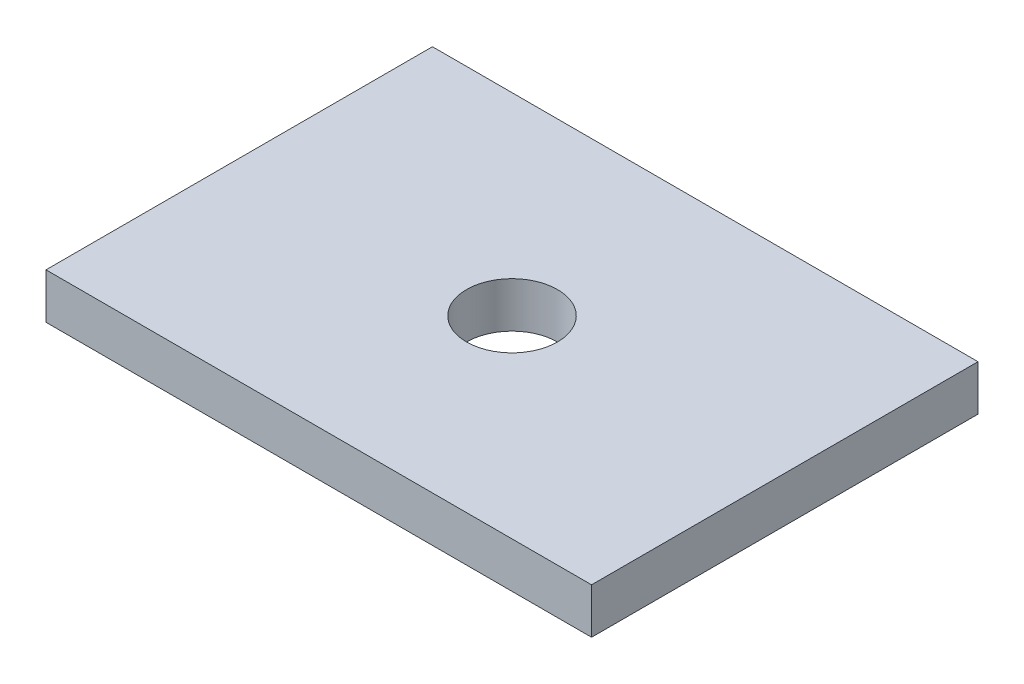
ISO-10303-21;
HEADER;
FILE_DESCRIPTION(('STEP AP214'),'2;1');
FILE_NAME('part.step','',(''),(''),'','','');
FILE_SCHEMA(('AUTOMOTIVE_DESIGN { 1 0 10303 214 1 1 1 1 }'));
ENDSEC;
DATA;
#1=APPLICATION_CONTEXT('core data for automotive mechanical design processes');
#2=APPLICATION_PROTOCOL_DEFINITION('international standard','automotive_design',2000,#1);
#3=PRODUCT_CONTEXT('',#1,'mechanical');
#4=PRODUCT('Part','Part','',(#3));
#5=PRODUCT_RELATED_PRODUCT_CATEGORY('part','',(#4));
#6=PRODUCT_DEFINITION_FORMATION('','',#4);
#7=PRODUCT_DEFINITION_CONTEXT('part definition',#1,'design');
#8=PRODUCT_DEFINITION('design','',#6,#7);
#9=PRODUCT_DEFINITION_SHAPE('','',#8);
#10=(LENGTH_UNIT() NAMED_UNIT(*) SI_UNIT(.MILLI.,.METRE.));
#11=(NAMED_UNIT(*) PLANE_ANGLE_UNIT() SI_UNIT($,.RADIAN.));
#12=(NAMED_UNIT(*) SI_UNIT($,.STERADIAN.) SOLID_ANGLE_UNIT());
#13=UNCERTAINTY_MEASURE_WITH_UNIT(LENGTH_MEASURE(1.E-05),#10,'distance_accuracy_value','');
#14=(GEOMETRIC_REPRESENTATION_CONTEXT(3) GLOBAL_UNCERTAINTY_ASSIGNED_CONTEXT((#13)) GLOBAL_UNIT_ASSIGNED_CONTEXT((#10,
#11,#12)) REPRESENTATION_CONTEXT('',''));
#15=CARTESIAN_POINT('',(0.,0.,0.));
#16=DIRECTION('',(0.,0.,1.));
#17=DIRECTION('',(1.,0.,0.));
#18=AXIS2_PLACEMENT_3D('',#15,#16,#17);
#19=CARTESIAN_POINT('',(0.,4.,0.));
#20=DIRECTION('',(0.,1.,0.));
#21=DIRECTION('',(0.,0.,1.));
#22=AXIS2_PLACEMENT_3D('',#19,#20,#21);
#23=PLANE('',#22);
#24=DIRECTION('',(0.,0.,-1.));
#25=VECTOR('',#24,1.);
#26=CARTESIAN_POINT('',(24.,4.,-17.));
#27=LINE('',#26,#25);
#28=CARTESIAN_POINT('',(24.,4.,17.));
#29=VERTEX_POINT('',#28);
#30=CARTESIAN_POINT('',(24.,4.,-17.));
#31=VERTEX_POINT('',#30);
#32=EDGE_CURVE('E85',#29,#31,#27,.T.);
#33=ORIENTED_EDGE('',*,*,#32,.T.);
#34=DIRECTION('',(-1.,0.,0.));
#35=VECTOR('',#34,1.);
#36=CARTESIAN_POINT('',(-24.,4.,-17.));
#37=LINE('',#36,#35);
#38=CARTESIAN_POINT('',(-24.,4.,-17.));
#39=VERTEX_POINT('',#38);
#40=EDGE_CURVE('E80',#31,#39,#37,.T.);
#41=ORIENTED_EDGE('',*,*,#40,.T.);
#42=DIRECTION('',(0.,0.,1.));
#43=VECTOR('',#42,1.);
#44=CARTESIAN_POINT('',(-24.,4.,-17.));
#45=LINE('',#44,#43);
#46=CARTESIAN_POINT('',(-24.,4.,17.));
#47=VERTEX_POINT('',#46);
#48=EDGE_CURVE('E83',#39,#47,#45,.T.);
#49=ORIENTED_EDGE('',*,*,#48,.T.);
#50=DIRECTION('',(1.,0.,0.));
#51=VECTOR('',#50,1.);
#52=CARTESIAN_POINT('',(-24.,4.,17.));
#53=LINE('',#52,#51);
#54=EDGE_CURVE('E50',#47,#29,#53,.T.);
#55=ORIENTED_EDGE('',*,*,#54,.T.);
#56=EDGE_LOOP('',(#33,#41,#49,#55));
#57=FACE_BOUND('',#56,.T.);
#58=CARTESIAN_POINT('',(0.,4.,0.));
#59=DIRECTION('',(0.,1.,0.));
#60=DIRECTION('',(0.,0.,1.));
#61=AXIS2_PLACEMENT_3D('',#58,#59,#60);
#62=CIRCLE('',#61,4.);
#63=CARTESIAN_POINT('',(0.,4.,4.));
#64=VERTEX_POINT('',#63);
#65=EDGE_CURVE('E100',#64,#64,#62,.T.);
#66=ORIENTED_EDGE('',*,*,#65,.F.);
#67=EDGE_LOOP('',(#66));
#68=FACE_BOUND('',#67,.T.);
#69=ADVANCED_FACE('F33',(#57,#68),#23,.T.);
#70=CARTESIAN_POINT('',(0.,0.,0.));
#71=DIRECTION('',(0.,1.,0.));
#72=DIRECTION('',(0.,0.,1.));
#73=AXIS2_PLACEMENT_3D('',#70,#71,#72);
#74=PLANE('',#73);
#75=DIRECTION('',(0.,0.,-1.));
#76=VECTOR('',#75,1.);
#77=CARTESIAN_POINT('',(24.,0.,-17.));
#78=LINE('',#77,#76);
#79=CARTESIAN_POINT('',(24.,0.,17.));
#80=VERTEX_POINT('',#79);
#81=CARTESIAN_POINT('',(24.,0.,-17.));
#82=VERTEX_POINT('',#81);
#83=EDGE_CURVE('E97',#80,#82,#78,.T.);
#84=ORIENTED_EDGE('',*,*,#83,.F.);
#85=DIRECTION('',(1.,0.,0.));
#86=VECTOR('',#85,1.);
#87=CARTESIAN_POINT('',(-24.,0.,17.));
#88=LINE('',#87,#86);
#89=CARTESIAN_POINT('',(-24.,0.,17.));
#90=VERTEX_POINT('',#89);
#91=EDGE_CURVE('E73',#90,#80,#88,.T.);
#92=ORIENTED_EDGE('',*,*,#91,.F.);
#93=DIRECTION('',(0.,0.,1.));
#94=VECTOR('',#93,1.);
#95=CARTESIAN_POINT('',(-24.,0.,-17.));
#96=LINE('',#95,#94);
#97=CARTESIAN_POINT('',(-24.,0.,-17.));
#98=VERTEX_POINT('',#97);
#99=EDGE_CURVE('E67',#98,#90,#96,.T.);
#100=ORIENTED_EDGE('',*,*,#99,.F.);
#101=DIRECTION('',(-1.,0.,0.));
#102=VECTOR('',#101,1.);
#103=CARTESIAN_POINT('',(-24.,0.,-17.));
#104=LINE('',#103,#102);
#105=EDGE_CURVE('E89',#82,#98,#104,.T.);
#106=ORIENTED_EDGE('',*,*,#105,.F.);
#107=EDGE_LOOP('',(#84,#92,#100,#106));
#108=FACE_BOUND('',#107,.T.);
#109=CARTESIAN_POINT('',(0.,0.,0.));
#110=DIRECTION('',(0.,1.,0.));
#111=DIRECTION('',(0.,0.,1.));
#112=AXIS2_PLACEMENT_3D('',#109,#110,#111);
#113=CIRCLE('',#112,4.);
#114=CARTESIAN_POINT('',(0.,0.,4.));
#115=VERTEX_POINT('',#114);
#116=EDGE_CURVE('E112',#115,#115,#113,.T.);
#117=ORIENTED_EDGE('',*,*,#116,.T.);
#118=EDGE_LOOP('',(#117));
#119=FACE_BOUND('',#118,.T.);
#120=ADVANCED_FACE('F108',(#108,#119),#74,.F.);
#121=CARTESIAN_POINT('',(24.,4.,-17.));
#122=DIRECTION('',(-1.,0.,0.));
#123=DIRECTION('',(0.,0.,1.));
#124=AXIS2_PLACEMENT_3D('',#121,#122,#123);
#125=PLANE('',#124);
#126=ORIENTED_EDGE('',*,*,#83,.T.);
#127=DIRECTION('',(0.,-1.,0.));
#128=VECTOR('',#127,1.);
#129=CARTESIAN_POINT('',(24.,4.,-17.));
#130=LINE('',#129,#128);
#131=EDGE_CURVE('E11',#31,#82,#130,.T.);
#132=ORIENTED_EDGE('',*,*,#131,.F.);
#133=ORIENTED_EDGE('',*,*,#32,.F.);
#134=DIRECTION('',(0.,-1.,0.));
#135=VECTOR('',#134,1.);
#136=CARTESIAN_POINT('',(24.,4.,17.));
#137=LINE('',#136,#135);
#138=EDGE_CURVE('E93',#29,#80,#137,.T.);
#139=ORIENTED_EDGE('',*,*,#138,.T.);
#140=EDGE_LOOP('',(#126,#132,#133,#139));
#141=FACE_BOUND('',#140,.T.);
#142=ADVANCED_FACE('F35',(#141),#125,.F.);
#143=CARTESIAN_POINT('',(-24.,4.,-17.));
#144=DIRECTION('',(0.,0.,1.));
#145=DIRECTION('',(1.,0.,0.));
#146=AXIS2_PLACEMENT_3D('',#143,#144,#145);
#147=PLANE('',#146);
#148=ORIENTED_EDGE('',*,*,#105,.T.);
#149=DIRECTION('',(0.,-1.,0.));
#150=VECTOR('',#149,1.);
#151=CARTESIAN_POINT('',(-24.,4.,-17.));
#152=LINE('',#151,#150);
#153=EDGE_CURVE('E42',#39,#98,#152,.T.);
#154=ORIENTED_EDGE('',*,*,#153,.F.);
#155=ORIENTED_EDGE('',*,*,#40,.F.);
#156=ORIENTED_EDGE('',*,*,#131,.T.);
#157=EDGE_LOOP('',(#148,#154,#155,#156));
#158=FACE_BOUND('',#157,.T.);
#159=ADVANCED_FACE('F88',(#158),#147,.F.);
#160=CARTESIAN_POINT('',(-24.,4.,-17.));
#161=DIRECTION('',(1.,0.,0.));
#162=DIRECTION('',(0.,0.,-1.));
#163=AXIS2_PLACEMENT_3D('',#160,#161,#162);
#164=PLANE('',#163);
#165=ORIENTED_EDGE('',*,*,#99,.T.);
#166=DIRECTION('',(0.,-1.,0.));
#167=VECTOR('',#166,1.);
#168=CARTESIAN_POINT('',(-24.,4.,17.));
#169=LINE('',#168,#167);
#170=EDGE_CURVE('E90',#47,#90,#169,.T.);
#171=ORIENTED_EDGE('',*,*,#170,.F.);
#172=ORIENTED_EDGE('',*,*,#48,.F.);
#173=ORIENTED_EDGE('',*,*,#153,.T.);
#174=EDGE_LOOP('',(#165,#171,#172,#173));
#175=FACE_BOUND('',#174,.T.);
#176=ADVANCED_FACE('F91',(#175),#164,.F.);
#177=CARTESIAN_POINT('',(-24.,4.,17.));
#178=DIRECTION('',(0.,0.,-1.));
#179=DIRECTION('',(-1.,0.,0.));
#180=AXIS2_PLACEMENT_3D('',#177,#178,#179);
#181=PLANE('',#180);
#182=ORIENTED_EDGE('',*,*,#91,.T.);
#183=ORIENTED_EDGE('',*,*,#138,.F.);
#184=ORIENTED_EDGE('',*,*,#54,.F.);
#185=ORIENTED_EDGE('',*,*,#170,.T.);
#186=EDGE_LOOP('',(#182,#183,#184,#185));
#187=FACE_BOUND('',#186,.T.);
#188=ADVANCED_FACE('F105',(#187),#181,.F.);
#189=CARTESIAN_POINT('',(0.,4.,0.));
#190=DIRECTION('',(0.,-1.,0.));
#191=DIRECTION('',(0.,0.,-1.));
#192=AXIS2_PLACEMENT_3D('',#189,#190,#191);
#193=CYLINDRICAL_SURFACE('',#192,4.);
#194=ORIENTED_EDGE('',*,*,#65,.T.);
#195=EDGE_LOOP('',(#194));
#196=FACE_BOUND('',#195,.T.);
#197=ORIENTED_EDGE('',*,*,#116,.F.);
#198=EDGE_LOOP('',(#197));
#199=FACE_BOUND('',#198,.T.);
#200=ADVANCED_FACE('F118',(#196,#199),#193,.F.);
#201=CLOSED_SHELL('',(#69,#120,#142,#159,#176,#188,#200));
#202=MANIFOLD_SOLID_BREP('B2',#201);
#203=ADVANCED_BREP_SHAPE_REPRESENTATION('',(#18,#202),#14);
#204=SHAPE_DEFINITION_REPRESENTATION(#9,#203);
ENDSEC;
END-ISO-10303-21;
